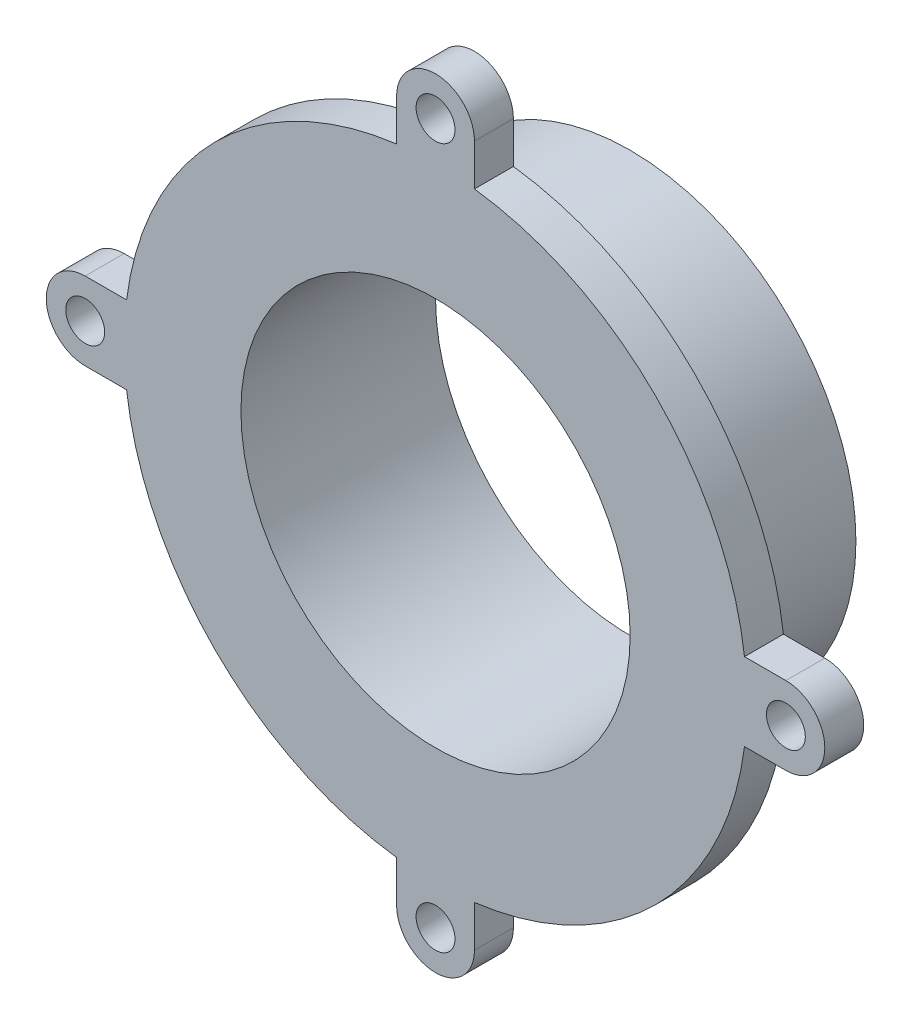
ISO-10303-21;
HEADER;
FILE_DESCRIPTION(('STEP AP214'),'2;1');
FILE_NAME('part.step','',(''),(''),'','','');
FILE_SCHEMA(('AUTOMOTIVE_DESIGN { 1 0 10303 214 1 1 1 1 }'));
ENDSEC;
DATA;
#1=APPLICATION_CONTEXT('core data for automotive mechanical design processes');
#2=APPLICATION_PROTOCOL_DEFINITION('international standard','automotive_design',2000,#1);
#3=PRODUCT_CONTEXT('',#1,'mechanical');
#4=PRODUCT('Part','Part','',(#3));
#5=PRODUCT_RELATED_PRODUCT_CATEGORY('part','',(#4));
#6=PRODUCT_DEFINITION_FORMATION('','',#4);
#7=PRODUCT_DEFINITION_CONTEXT('part definition',#1,'design');
#8=PRODUCT_DEFINITION('design','',#6,#7);
#9=PRODUCT_DEFINITION_SHAPE('','',#8);
#10=(LENGTH_UNIT() NAMED_UNIT(*) SI_UNIT(.MILLI.,.METRE.));
#11=(NAMED_UNIT(*) PLANE_ANGLE_UNIT() SI_UNIT($,.RADIAN.));
#12=(NAMED_UNIT(*) SI_UNIT($,.STERADIAN.) SOLID_ANGLE_UNIT());
#13=UNCERTAINTY_MEASURE_WITH_UNIT(LENGTH_MEASURE(1.E-05),#10,'distance_accuracy_value','');
#14=(GEOMETRIC_REPRESENTATION_CONTEXT(3) GLOBAL_UNCERTAINTY_ASSIGNED_CONTEXT((#13)) GLOBAL_UNIT_ASSIGNED_CONTEXT((#10,
#11,#12)) REPRESENTATION_CONTEXT('',''));
#15=CARTESIAN_POINT('',(0.,0.,0.));
#16=DIRECTION('',(0.,0.,1.));
#17=DIRECTION('',(1.,0.,0.));
#18=AXIS2_PLACEMENT_3D('',#15,#16,#17);
#19=CARTESIAN_POINT('',(0.,0.,5.));
#20=DIRECTION('',(0.,0.,-1.));
#21=DIRECTION('',(-1.,0.,0.));
#22=AXIS2_PLACEMENT_3D('',#19,#20,#21);
#23=CYLINDRICAL_SURFACE('',#22,40.);
#24=CARTESIAN_POINT('',(0.,0.,5.));
#25=DIRECTION('',(0.,0.,1.));
#26=DIRECTION('',(1.,0.,0.));
#27=AXIS2_PLACEMENT_3D('',#24,#25,#26);
#28=CIRCLE('',#27,40.);
#29=CARTESIAN_POINT('',(39.6862696659688,5.00000000000042,5.));
#30=VERTEX_POINT('',#29);
#31=CARTESIAN_POINT('',(5.,39.6862696659689,5.));
#32=VERTEX_POINT('',#31);
#33=EDGE_CURVE('E50',#30,#32,#28,.T.);
#34=ORIENTED_EDGE('',*,*,#33,.F.);
#35=DIRECTION('',(0.,0.,1.));
#36=VECTOR('',#35,1.);
#37=CARTESIAN_POINT('',(39.6862696659688,5.00000000000042,-14.3656894510189));
#38=LINE('',#37,#36);
#39=CARTESIAN_POINT('',(39.6862696659688,5.00000000000042,0.));
#40=VERTEX_POINT('',#39);
#41=EDGE_CURVE('E160',#40,#30,#38,.T.);
#42=ORIENTED_EDGE('',*,*,#41,.F.);
#43=CARTESIAN_POINT('',(0.,0.,0.));
#44=DIRECTION('',(0.,0.,1.));
#45=DIRECTION('',(1.,0.,0.));
#46=AXIS2_PLACEMENT_3D('',#43,#44,#45);
#47=CIRCLE('',#46,40.);
#48=CARTESIAN_POINT('',(5.,39.6862696659689,0.));
#49=VERTEX_POINT('',#48);
#50=EDGE_CURVE('E290',#40,#49,#47,.T.);
#51=ORIENTED_EDGE('',*,*,#50,.T.);
#52=DIRECTION('',(0.,0.,1.));
#53=VECTOR('',#52,1.);
#54=CARTESIAN_POINT('',(5.,39.6862696659689,-14.3656894510188));
#55=LINE('',#54,#53);
#56=EDGE_CURVE('E273',#49,#32,#55,.T.);
#57=ORIENTED_EDGE('',*,*,#56,.T.);
#58=EDGE_LOOP('',(#34,#42,#51,#57));
#59=FACE_BOUND('',#58,.T.);
#60=ADVANCED_FACE('F35',(#59),#23,.T.);
#61=CARTESIAN_POINT('',(5.,-39.6862696659689,0.));
#62=VERTEX_POINT('',#61);
#63=CARTESIAN_POINT('',(39.6862696659689,-4.99999999999958,0.));
#64=VERTEX_POINT('',#63);
#65=EDGE_CURVE('E297',#62,#64,#47,.T.);
#66=ORIENTED_EDGE('',*,*,#65,.T.);
#67=DIRECTION('',(0.,0.,1.));
#68=VECTOR('',#67,1.);
#69=CARTESIAN_POINT('',(39.6862696659689,-4.99999999999958,-14.3656894510189));
#70=LINE('',#69,#68);
#71=CARTESIAN_POINT('',(39.6862696659689,-4.99999999999958,5.));
#72=VERTEX_POINT('',#71);
#73=EDGE_CURVE('E58',#64,#72,#70,.T.);
#74=ORIENTED_EDGE('',*,*,#73,.T.);
#75=CARTESIAN_POINT('',(5.,-39.6862696659689,5.));
#76=VERTEX_POINT('',#75);
#77=EDGE_CURVE('E296',#76,#72,#28,.T.);
#78=ORIENTED_EDGE('',*,*,#77,.F.);
#79=DIRECTION('',(0.,0.,1.));
#80=VECTOR('',#79,1.);
#81=CARTESIAN_POINT('',(5.,-39.6862696659689,-14.3656894510188));
#82=LINE('',#81,#80);
#83=EDGE_CURVE('E213',#62,#76,#82,.T.);
#84=ORIENTED_EDGE('',*,*,#83,.F.);
#85=EDGE_LOOP('',(#66,#74,#78,#84));
#86=FACE_BOUND('',#85,.T.);
#87=ADVANCED_FACE('F300',(#86),#23,.T.);
#88=CARTESIAN_POINT('',(-39.6862696659688,-5.00000000000014,0.));
#89=VERTEX_POINT('',#88);
#90=CARTESIAN_POINT('',(-5.,-39.6862696659689,0.));
#91=VERTEX_POINT('',#90);
#92=EDGE_CURVE('E293',#89,#91,#47,.T.);
#93=ORIENTED_EDGE('',*,*,#92,.T.);
#94=DIRECTION('',(0.,0.,1.));
#95=VECTOR('',#94,1.);
#96=CARTESIAN_POINT('',(-5.,-39.6862696659689,-14.3656894510188));
#97=LINE('',#96,#95);
#98=CARTESIAN_POINT('',(-5.,-39.6862696659689,5.));
#99=VERTEX_POINT('',#98);
#100=EDGE_CURVE('E211',#91,#99,#97,.T.);
#101=ORIENTED_EDGE('',*,*,#100,.T.);
#102=CARTESIAN_POINT('',(-39.6862696659688,-5.00000000000014,5.));
#103=VERTEX_POINT('',#102);
#104=EDGE_CURVE('E291',#103,#99,#28,.T.);
#105=ORIENTED_EDGE('',*,*,#104,.F.);
#106=DIRECTION('',(0.,0.,1.));
#107=VECTOR('',#106,1.);
#108=CARTESIAN_POINT('',(-39.6862696659688,-5.00000000000014,-14.3656894510189));
#109=LINE('',#108,#107);
#110=EDGE_CURVE('E244',#89,#103,#109,.T.);
#111=ORIENTED_EDGE('',*,*,#110,.F.);
#112=EDGE_LOOP('',(#93,#101,#105,#111));
#113=FACE_BOUND('',#112,.T.);
#114=ADVANCED_FACE('F324',(#113),#23,.T.);
#115=CARTESIAN_POINT('',(-5.,39.6862696659689,0.));
#116=VERTEX_POINT('',#115);
#117=CARTESIAN_POINT('',(-39.6862696659689,4.99999999999986,0.));
#118=VERTEX_POINT('',#117);
#119=EDGE_CURVE('E292',#116,#118,#47,.T.);
#120=ORIENTED_EDGE('',*,*,#119,.T.);
#121=DIRECTION('',(0.,0.,1.));
#122=VECTOR('',#121,1.);
#123=CARTESIAN_POINT('',(-39.6862696659689,4.99999999999986,-14.3656894510189));
#124=LINE('',#123,#122);
#125=CARTESIAN_POINT('',(-39.6862696659689,4.99999999999986,5.));
#126=VERTEX_POINT('',#125);
#127=EDGE_CURVE('E242',#118,#126,#124,.T.);
#128=ORIENTED_EDGE('',*,*,#127,.T.);
#129=CARTESIAN_POINT('',(-5.,39.6862696659689,5.));
#130=VERTEX_POINT('',#129);
#131=EDGE_CURVE('E43',#130,#126,#28,.T.);
#132=ORIENTED_EDGE('',*,*,#131,.F.);
#133=DIRECTION('',(0.,0.,1.));
#134=VECTOR('',#133,1.);
#135=CARTESIAN_POINT('',(-5.,39.6862696659689,-14.3656894510188));
#136=LINE('',#135,#134);
#137=EDGE_CURVE('E275',#116,#130,#136,.T.);
#138=ORIENTED_EDGE('',*,*,#137,.F.);
#139=EDGE_LOOP('',(#120,#128,#132,#138));
#140=FACE_BOUND('',#139,.T.);
#141=ADVANCED_FACE('F37',(#140),#23,.T.);
#142=CARTESIAN_POINT('',(0.,0.,5.));
#143=DIRECTION('',(0.,0.,1.));
#144=DIRECTION('',(1.,0.,0.));
#145=AXIS2_PLACEMENT_3D('',#142,#143,#144);
#146=PLANE('',#145);
#147=CARTESIAN_POINT('',(0.,0.,5.));
#148=DIRECTION('',(0.,0.,1.));
#149=DIRECTION('',(1.,0.,0.));
#150=AXIS2_PLACEMENT_3D('',#147,#148,#149);
#151=CIRCLE('',#150,25.);
#152=CARTESIAN_POINT('',(25.,0.,5.));
#153=VERTEX_POINT('',#152);
#154=EDGE_CURVE('E287',#153,#153,#151,.T.);
#155=ORIENTED_EDGE('',*,*,#154,.F.);
#156=EDGE_LOOP('',(#155));
#157=FACE_BOUND('',#156,.T.);
#158=ORIENTED_EDGE('',*,*,#131,.T.);
#159=DIRECTION('',(-1.,0.,0.));
#160=VECTOR('',#159,1.);
#161=CARTESIAN_POINT('',(-39.6862696659689,4.99999999999986,5.));
#162=LINE('',#161,#160);
#163=CARTESIAN_POINT('',(-45.,4.99999999999984,5.));
#164=VERTEX_POINT('',#163);
#165=EDGE_CURVE('E237',#126,#164,#162,.T.);
#166=ORIENTED_EDGE('',*,*,#165,.T.);
#167=CARTESIAN_POINT('',(-45.,-1.57116660247941E-13,5.));
#168=DIRECTION('',(0.,0.,1.));
#169=DIRECTION('',(0.,-1.,0.));
#170=AXIS2_PLACEMENT_3D('',#167,#168,#169);
#171=CIRCLE('',#170,5.);
#172=CARTESIAN_POINT('',(-45.,-5.00000000000016,5.));
#173=VERTEX_POINT('',#172);
#174=EDGE_CURVE('E231',#164,#173,#171,.T.);
#175=ORIENTED_EDGE('',*,*,#174,.T.);
#176=DIRECTION('',(1.,0.,0.));
#177=VECTOR('',#176,1.);
#178=CARTESIAN_POINT('',(-39.6862696659688,-5.00000000000014,5.));
#179=LINE('',#178,#177);
#180=EDGE_CURVE('E234',#173,#103,#179,.T.);
#181=ORIENTED_EDGE('',*,*,#180,.T.);
#182=ORIENTED_EDGE('',*,*,#104,.T.);
#183=DIRECTION('',(0.,-1.,0.));
#184=VECTOR('',#183,1.);
#185=CARTESIAN_POINT('',(-5.,-39.6862696659689,5.));
#186=LINE('',#185,#184);
#187=CARTESIAN_POINT('',(-5.,-45.,5.));
#188=VERTEX_POINT('',#187);
#189=EDGE_CURVE('E206',#99,#188,#186,.T.);
#190=ORIENTED_EDGE('',*,*,#189,.T.);
#191=CARTESIAN_POINT('',(0.,-45.,5.));
#192=DIRECTION('',(0.,0.,1.));
#193=DIRECTION('',(1.,0.,0.));
#194=AXIS2_PLACEMENT_3D('',#191,#192,#193);
#195=CIRCLE('',#194,5.);
#196=CARTESIAN_POINT('',(5.,-45.,5.));
#197=VERTEX_POINT('',#196);
#198=EDGE_CURVE('E200',#188,#197,#195,.T.);
#199=ORIENTED_EDGE('',*,*,#198,.T.);
#200=DIRECTION('',(0.,1.,0.));
#201=VECTOR('',#200,1.);
#202=CARTESIAN_POINT('',(5.,-39.6862696659689,5.));
#203=LINE('',#202,#201);
#204=EDGE_CURVE('E203',#197,#76,#203,.T.);
#205=ORIENTED_EDGE('',*,*,#204,.T.);
#206=ORIENTED_EDGE('',*,*,#77,.T.);
#207=DIRECTION('',(1.,0.,0.));
#208=VECTOR('',#207,1.);
#209=CARTESIAN_POINT('',(39.6862696659689,-4.99999999999958,5.));
#210=LINE('',#209,#208);
#211=CARTESIAN_POINT('',(45.0000000000001,-4.99999999999953,5.));
#212=VERTEX_POINT('',#211);
#213=EDGE_CURVE('E161',#72,#212,#210,.T.);
#214=ORIENTED_EDGE('',*,*,#213,.T.);
#215=CARTESIAN_POINT('',(45.,4.71349980743823E-13,5.));
#216=DIRECTION('',(0.,0.,1.));
#217=DIRECTION('',(0.,1.,0.));
#218=AXIS2_PLACEMENT_3D('',#215,#216,#217);
#219=CIRCLE('',#218,5.);
#220=CARTESIAN_POINT('',(44.9999999999999,5.00000000000047,5.));
#221=VERTEX_POINT('',#220);
#222=EDGE_CURVE('E155',#212,#221,#219,.T.);
#223=ORIENTED_EDGE('',*,*,#222,.T.);
#224=DIRECTION('',(-1.,0.,0.));
#225=VECTOR('',#224,1.);
#226=CARTESIAN_POINT('',(39.6862696659688,5.00000000000042,5.));
#227=LINE('',#226,#225);
#228=EDGE_CURVE('E164',#221,#30,#227,.T.);
#229=ORIENTED_EDGE('',*,*,#228,.T.);
#230=ORIENTED_EDGE('',*,*,#33,.T.);
#231=DIRECTION('',(0.,1.,0.));
#232=VECTOR('',#231,1.);
#233=CARTESIAN_POINT('',(5.,39.6862696659689,5.));
#234=LINE('',#233,#232);
#235=CARTESIAN_POINT('',(5.,45.,5.));
#236=VERTEX_POINT('',#235);
#237=EDGE_CURVE('E268',#32,#236,#234,.T.);
#238=ORIENTED_EDGE('',*,*,#237,.T.);
#239=CARTESIAN_POINT('',(0.,45.,5.));
#240=DIRECTION('',(0.,0.,1.));
#241=DIRECTION('',(-1.,0.,0.));
#242=AXIS2_PLACEMENT_3D('',#239,#240,#241);
#243=CIRCLE('',#242,5.);
#244=CARTESIAN_POINT('',(-5.,45.,5.));
#245=VERTEX_POINT('',#244);
#246=EDGE_CURVE('E262',#236,#245,#243,.T.);
#247=ORIENTED_EDGE('',*,*,#246,.T.);
#248=DIRECTION('',(0.,-1.,0.));
#249=VECTOR('',#248,1.);
#250=CARTESIAN_POINT('',(-5.,39.6862696659689,5.));
#251=LINE('',#250,#249);
#252=EDGE_CURVE('E265',#245,#130,#251,.T.);
#253=ORIENTED_EDGE('',*,*,#252,.T.);
#254=EDGE_LOOP('',(#158,#166,#175,#181,#182,#190,#199,#205,#206,#214,#223,#229,#230,#238,#247,#253));
#255=FACE_BOUND('',#254,.T.);
#256=CARTESIAN_POINT('',(0.,45.,5.));
#257=DIRECTION('',(0.,0.,1.));
#258=DIRECTION('',(1.,0.,0.));
#259=AXIS2_PLACEMENT_3D('',#256,#257,#258);
#260=CIRCLE('',#259,2.5);
#261=CARTESIAN_POINT('',(2.5,45.,5.));
#262=VERTEX_POINT('',#261);
#263=EDGE_CURVE('E250',#262,#262,#260,.T.);
#264=ORIENTED_EDGE('',*,*,#263,.F.);
#265=EDGE_LOOP('',(#264));
#266=FACE_BOUND('',#265,.T.);
#267=CARTESIAN_POINT('',(-45.,-1.57116660247941E-13,5.));
#268=DIRECTION('',(0.,0.,1.));
#269=DIRECTION('',(0.,1.,0.));
#270=AXIS2_PLACEMENT_3D('',#267,#268,#269);
#271=CIRCLE('',#270,2.5);
#272=CARTESIAN_POINT('',(-45.,2.49999999999985,5.));
#273=VERTEX_POINT('',#272);
#274=EDGE_CURVE('E219',#273,#273,#271,.T.);
#275=ORIENTED_EDGE('',*,*,#274,.F.);
#276=EDGE_LOOP('',(#275));
#277=FACE_BOUND('',#276,.T.);
#278=CARTESIAN_POINT('',(0.,-45.,5.));
#279=DIRECTION('',(0.,0.,1.));
#280=DIRECTION('',(-1.,0.,0.));
#281=AXIS2_PLACEMENT_3D('',#278,#279,#280);
#282=CIRCLE('',#281,2.5);
#283=CARTESIAN_POINT('',(-2.5,-45.,5.));
#284=VERTEX_POINT('',#283);
#285=EDGE_CURVE('E187',#284,#284,#282,.T.);
#286=ORIENTED_EDGE('',*,*,#285,.F.);
#287=EDGE_LOOP('',(#286));
#288=FACE_BOUND('',#287,.T.);
#289=CARTESIAN_POINT('',(45.,4.71349980743823E-13,5.));
#290=DIRECTION('',(0.,0.,1.));
#291=DIRECTION('',(0.,-1.,0.));
#292=AXIS2_PLACEMENT_3D('',#289,#290,#291);
#293=CIRCLE('',#292,2.5);
#294=CARTESIAN_POINT('',(45.,-2.49999999999953,5.));
#295=VERTEX_POINT('',#294);
#296=EDGE_CURVE('E172',#295,#295,#293,.T.);
#297=ORIENTED_EDGE('',*,*,#296,.F.);
#298=EDGE_LOOP('',(#297));
#299=FACE_BOUND('',#298,.T.);
#300=ADVANCED_FACE('F169',(#157,#255,#266,#277,#288,#299),#146,.T.);
#301=CARTESIAN_POINT('',(0.,0.,0.));
#302=DIRECTION('',(0.,0.,1.));
#303=DIRECTION('',(1.,0.,0.));
#304=AXIS2_PLACEMENT_3D('',#301,#302,#303);
#305=PLANE('',#304);
#306=CARTESIAN_POINT('',(0.,0.,0.));
#307=DIRECTION('',(0.,0.,1.));
#308=DIRECTION('',(1.,0.,0.));
#309=AXIS2_PLACEMENT_3D('',#306,#307,#308);
#310=CIRCLE('',#309,29.);
#311=CARTESIAN_POINT('',(29.,0.,0.));
#312=VERTEX_POINT('',#311);
#313=EDGE_CURVE('E11',#312,#312,#310,.F.);
#314=ORIENTED_EDGE('',*,*,#313,.F.);
#315=EDGE_LOOP('',(#314));
#316=FACE_BOUND('',#315,.T.);
#317=ORIENTED_EDGE('',*,*,#119,.F.);
#318=DIRECTION('',(0.,1.,0.));
#319=VECTOR('',#318,1.);
#320=CARTESIAN_POINT('',(-5.,39.6862696659689,0.));
#321=LINE('',#320,#319);
#322=CARTESIAN_POINT('',(-5.,45.,0.));
#323=VERTEX_POINT('',#322);
#324=EDGE_CURVE('E251',#116,#323,#321,.T.);
#325=ORIENTED_EDGE('',*,*,#324,.T.);
#326=CARTESIAN_POINT('',(0.,45.,0.));
#327=DIRECTION('',(0.,0.,1.));
#328=DIRECTION('',(1.,0.,0.));
#329=AXIS2_PLACEMENT_3D('',#326,#327,#328);
#330=CIRCLE('',#329,5.);
#331=CARTESIAN_POINT('',(5.,45.,0.));
#332=VERTEX_POINT('',#331);
#333=EDGE_CURVE('E254',#323,#332,#330,.F.);
#334=ORIENTED_EDGE('',*,*,#333,.T.);
#335=DIRECTION('',(0.,-1.,0.));
#336=VECTOR('',#335,1.);
#337=CARTESIAN_POINT('',(5.,39.6862696659689,0.));
#338=LINE('',#337,#336);
#339=EDGE_CURVE('E255',#332,#49,#338,.T.);
#340=ORIENTED_EDGE('',*,*,#339,.T.);
#341=ORIENTED_EDGE('',*,*,#50,.F.);
#342=DIRECTION('',(1.,0.,0.));
#343=VECTOR('',#342,1.);
#344=CARTESIAN_POINT('',(39.6862696659688,5.00000000000042,0.));
#345=LINE('',#344,#343);
#346=CARTESIAN_POINT('',(44.9999999999999,5.00000000000047,0.));
#347=VERTEX_POINT('',#346);
#348=EDGE_CURVE('E188',#40,#347,#345,.T.);
#349=ORIENTED_EDGE('',*,*,#348,.T.);
#350=CARTESIAN_POINT('',(45.,4.71349980743823E-13,0.));
#351=DIRECTION('',(0.,0.,1.));
#352=DIRECTION('',(1.,0.,0.));
#353=AXIS2_PLACEMENT_3D('',#350,#351,#352);
#354=CIRCLE('',#353,5.);
#355=CARTESIAN_POINT('',(45.0000000000001,-4.99999999999953,0.));
#356=VERTEX_POINT('',#355);
#357=EDGE_CURVE('E157',#347,#356,#354,.F.);
#358=ORIENTED_EDGE('',*,*,#357,.T.);
#359=DIRECTION('',(-1.,0.,0.));
#360=VECTOR('',#359,1.);
#361=CARTESIAN_POINT('',(39.6862696659689,-4.99999999999958,0.));
#362=LINE('',#361,#360);
#363=EDGE_CURVE('E181',#356,#64,#362,.T.);
#364=ORIENTED_EDGE('',*,*,#363,.T.);
#365=ORIENTED_EDGE('',*,*,#65,.F.);
#366=DIRECTION('',(0.,-1.,0.));
#367=VECTOR('',#366,1.);
#368=CARTESIAN_POINT('',(5.,-39.6862696659689,0.));
#369=LINE('',#368,#367);
#370=CARTESIAN_POINT('',(5.,-45.,0.));
#371=VERTEX_POINT('',#370);
#372=EDGE_CURVE('E189',#62,#371,#369,.T.);
#373=ORIENTED_EDGE('',*,*,#372,.T.);
#374=CARTESIAN_POINT('',(0.,-45.,0.));
#375=DIRECTION('',(0.,0.,1.));
#376=DIRECTION('',(1.,0.,0.));
#377=AXIS2_PLACEMENT_3D('',#374,#375,#376);
#378=CIRCLE('',#377,5.);
#379=CARTESIAN_POINT('',(-5.,-45.,0.));
#380=VERTEX_POINT('',#379);
#381=EDGE_CURVE('E192',#371,#380,#378,.F.);
#382=ORIENTED_EDGE('',*,*,#381,.T.);
#383=DIRECTION('',(0.,1.,0.));
#384=VECTOR('',#383,1.);
#385=CARTESIAN_POINT('',(-5.,-39.6862696659689,0.));
#386=LINE('',#385,#384);
#387=EDGE_CURVE('E193',#380,#91,#386,.T.);
#388=ORIENTED_EDGE('',*,*,#387,.T.);
#389=ORIENTED_EDGE('',*,*,#92,.F.);
#390=DIRECTION('',(-1.,0.,0.));
#391=VECTOR('',#390,1.);
#392=CARTESIAN_POINT('',(-39.6862696659688,-5.00000000000014,0.));
#393=LINE('',#392,#391);
#394=CARTESIAN_POINT('',(-45.,-5.00000000000016,0.));
#395=VERTEX_POINT('',#394);
#396=EDGE_CURVE('E220',#89,#395,#393,.T.);
#397=ORIENTED_EDGE('',*,*,#396,.T.);
#398=CARTESIAN_POINT('',(-45.,-1.57116660247941E-13,0.));
#399=DIRECTION('',(0.,0.,1.));
#400=DIRECTION('',(1.,0.,0.));
#401=AXIS2_PLACEMENT_3D('',#398,#399,#400);
#402=CIRCLE('',#401,5.);
#403=CARTESIAN_POINT('',(-45.,4.99999999999984,0.));
#404=VERTEX_POINT('',#403);
#405=EDGE_CURVE('E223',#395,#404,#402,.F.);
#406=ORIENTED_EDGE('',*,*,#405,.T.);
#407=DIRECTION('',(1.,0.,0.));
#408=VECTOR('',#407,1.);
#409=CARTESIAN_POINT('',(-39.6862696659689,4.99999999999986,0.));
#410=LINE('',#409,#408);
#411=EDGE_CURVE('E224',#404,#118,#410,.T.);
#412=ORIENTED_EDGE('',*,*,#411,.T.);
#413=EDGE_LOOP('',(#317,#325,#334,#340,#341,#349,#358,#364,#365,#373,#382,#388,#389,#397,#406,#412));
#414=FACE_BOUND('',#413,.T.);
#415=CARTESIAN_POINT('',(0.,45.,0.));
#416=DIRECTION('',(0.,0.,1.));
#417=DIRECTION('',(1.,0.,0.));
#418=AXIS2_PLACEMENT_3D('',#415,#416,#417);
#419=CIRCLE('',#418,2.5);
#420=CARTESIAN_POINT('',(2.5,45.,0.));
#421=VERTEX_POINT('',#420);
#422=EDGE_CURVE('E253',#421,#421,#419,.F.);
#423=ORIENTED_EDGE('',*,*,#422,.F.);
#424=EDGE_LOOP('',(#423));
#425=FACE_BOUND('',#424,.T.);
#426=CARTESIAN_POINT('',(-45.,-1.57116660247941E-13,0.));
#427=DIRECTION('',(0.,0.,1.));
#428=DIRECTION('',(1.,0.,0.));
#429=AXIS2_PLACEMENT_3D('',#426,#427,#428);
#430=CIRCLE('',#429,2.5);
#431=CARTESIAN_POINT('',(-42.5,-1.57116660247941E-13,0.));
#432=VERTEX_POINT('',#431);
#433=EDGE_CURVE('E222',#432,#432,#430,.F.);
#434=ORIENTED_EDGE('',*,*,#433,.F.);
#435=EDGE_LOOP('',(#434));
#436=FACE_BOUND('',#435,.T.);
#437=CARTESIAN_POINT('',(0.,-45.,0.));
#438=DIRECTION('',(0.,0.,1.));
#439=DIRECTION('',(1.,0.,0.));
#440=AXIS2_PLACEMENT_3D('',#437,#438,#439);
#441=CIRCLE('',#440,2.5);
#442=CARTESIAN_POINT('',(2.5,-45.,0.));
#443=VERTEX_POINT('',#442);
#444=EDGE_CURVE('E191',#443,#443,#441,.F.);
#445=ORIENTED_EDGE('',*,*,#444,.F.);
#446=EDGE_LOOP('',(#445));
#447=FACE_BOUND('',#446,.T.);
#448=CARTESIAN_POINT('',(45.,4.71349980743823E-13,0.));
#449=DIRECTION('',(0.,0.,1.));
#450=DIRECTION('',(1.,0.,0.));
#451=AXIS2_PLACEMENT_3D('',#448,#449,#450);
#452=CIRCLE('',#451,2.5);
#453=CARTESIAN_POINT('',(47.5,4.71349980743823E-13,0.));
#454=VERTEX_POINT('',#453);
#455=EDGE_CURVE('E184',#454,#454,#452,.F.);
#456=ORIENTED_EDGE('',*,*,#455,.F.);
#457=EDGE_LOOP('',(#456));
#458=FACE_BOUND('',#457,.T.);
#459=ADVANCED_FACE('F304',(#316,#414,#425,#436,#447,#458),#305,.F.);
#460=CARTESIAN_POINT('',(0.,0.,8.));
#461=DIRECTION('',(0.,0.,-1.));
#462=DIRECTION('',(-1.,0.,0.));
#463=AXIS2_PLACEMENT_3D('',#460,#461,#462);
#464=CYLINDRICAL_SURFACE('',#463,25.);
#465=ORIENTED_EDGE('',*,*,#154,.T.);
#466=EDGE_LOOP('',(#465));
#467=FACE_BOUND('',#466,.T.);
#468=CARTESIAN_POINT('',(0.,0.,-20.));
#469=DIRECTION('',(0.,0.,-1.));
#470=DIRECTION('',(-1.,0.,0.));
#471=AXIS2_PLACEMENT_3D('',#468,#469,#470);
#472=CIRCLE('',#471,25.);
#473=CARTESIAN_POINT('',(-25.,0.,-20.));
#474=VERTEX_POINT('',#473);
#475=EDGE_CURVE('E281',#474,#474,#472,.F.);
#476=ORIENTED_EDGE('',*,*,#475,.F.);
#477=EDGE_LOOP('',(#476));
#478=FACE_BOUND('',#477,.T.);
#479=ADVANCED_FACE('F403',(#467,#478),#464,.F.);
#480=CARTESIAN_POINT('',(0.,0.,-20.));
#481=DIRECTION('',(0.,0.,1.));
#482=DIRECTION('',(1.,0.,0.));
#483=AXIS2_PLACEMENT_3D('',#480,#481,#482);
#484=CYLINDRICAL_SURFACE('',#483,29.);
#485=CARTESIAN_POINT('',(0.,0.,-20.));
#486=DIRECTION('',(0.,0.,-1.));
#487=DIRECTION('',(-1.,0.,0.));
#488=AXIS2_PLACEMENT_3D('',#485,#486,#487);
#489=CIRCLE('',#488,29.);
#490=CARTESIAN_POINT('',(-29.,0.,-20.));
#491=VERTEX_POINT('',#490);
#492=EDGE_CURVE('E284',#491,#491,#489,.T.);
#493=ORIENTED_EDGE('',*,*,#492,.F.);
#494=EDGE_LOOP('',(#493));
#495=FACE_BOUND('',#494,.T.);
#496=ORIENTED_EDGE('',*,*,#313,.T.);
#497=EDGE_LOOP('',(#496));
#498=FACE_BOUND('',#497,.T.);
#499=ADVANCED_FACE('F399',(#495,#498),#484,.T.);
#500=CARTESIAN_POINT('',(0.,0.,-20.));
#501=DIRECTION('',(0.,0.,-1.));
#502=DIRECTION('',(-1.,0.,0.));
#503=AXIS2_PLACEMENT_3D('',#500,#501,#502);
#504=PLANE('',#503);
#505=ORIENTED_EDGE('',*,*,#475,.T.);
#506=EDGE_LOOP('',(#505));
#507=FACE_BOUND('',#506,.T.);
#508=ORIENTED_EDGE('',*,*,#492,.T.);
#509=EDGE_LOOP('',(#508));
#510=FACE_BOUND('',#509,.T.);
#511=ADVANCED_FACE('F392',(#507,#510),#504,.T.);
#512=CARTESIAN_POINT('',(-5.,39.6862696659689,-14.3656894510188));
#513=DIRECTION('',(-1.,0.,0.));
#514=DIRECTION('',(0.,0.,1.));
#515=AXIS2_PLACEMENT_3D('',#512,#513,#514);
#516=PLANE('',#515);
#517=ORIENTED_EDGE('',*,*,#324,.F.);
#518=ORIENTED_EDGE('',*,*,#137,.T.);
#519=ORIENTED_EDGE('',*,*,#252,.F.);
#520=DIRECTION('',(0.,0.,1.));
#521=VECTOR('',#520,1.);
#522=CARTESIAN_POINT('',(-5.,45.,-14.3656894510188));
#523=LINE('',#522,#521);
#524=EDGE_CURVE('E271',#323,#245,#523,.T.);
#525=ORIENTED_EDGE('',*,*,#524,.F.);
#526=EDGE_LOOP('',(#517,#518,#519,#525));
#527=FACE_BOUND('',#526,.T.);
#528=ADVANCED_FACE('F388',(#527),#516,.T.);
#529=CARTESIAN_POINT('',(5.,39.6862696659689,-14.3656894510188));
#530=DIRECTION('',(1.,0.,0.));
#531=DIRECTION('',(0.,0.,-1.));
#532=AXIS2_PLACEMENT_3D('',#529,#530,#531);
#533=PLANE('',#532);
#534=ORIENTED_EDGE('',*,*,#339,.F.);
#535=DIRECTION('',(0.,0.,1.));
#536=VECTOR('',#535,1.);
#537=CARTESIAN_POINT('',(5.,45.,-14.3656894510188));
#538=LINE('',#537,#536);
#539=EDGE_CURVE('E258',#332,#236,#538,.T.);
#540=ORIENTED_EDGE('',*,*,#539,.T.);
#541=ORIENTED_EDGE('',*,*,#237,.F.);
#542=ORIENTED_EDGE('',*,*,#56,.F.);
#543=EDGE_LOOP('',(#534,#540,#541,#542));
#544=FACE_BOUND('',#543,.T.);
#545=ADVANCED_FACE('F385',(#544),#533,.T.);
#546=CARTESIAN_POINT('',(0.,45.,-14.3656894510188));
#547=DIRECTION('',(0.,0.,1.));
#548=DIRECTION('',(1.,0.,0.));
#549=AXIS2_PLACEMENT_3D('',#546,#547,#548);
#550=CYLINDRICAL_SURFACE('',#549,5.);
#551=ORIENTED_EDGE('',*,*,#333,.F.);
#552=ORIENTED_EDGE('',*,*,#524,.T.);
#553=ORIENTED_EDGE('',*,*,#246,.F.);
#554=ORIENTED_EDGE('',*,*,#539,.F.);
#555=EDGE_LOOP('',(#551,#552,#553,#554));
#556=FACE_BOUND('',#555,.T.);
#557=ADVANCED_FACE('F383',(#556),#550,.T.);
#558=CARTESIAN_POINT('',(0.,45.,-14.3656894510188));
#559=DIRECTION('',(0.,0.,1.));
#560=DIRECTION('',(1.,0.,0.));
#561=AXIS2_PLACEMENT_3D('',#558,#559,#560);
#562=CYLINDRICAL_SURFACE('',#561,2.5);
#563=ORIENTED_EDGE('',*,*,#422,.T.);
#564=EDGE_LOOP('',(#563));
#565=FACE_BOUND('',#564,.T.);
#566=ORIENTED_EDGE('',*,*,#263,.T.);
#567=EDGE_LOOP('',(#566));
#568=FACE_BOUND('',#567,.T.);
#569=ADVANCED_FACE('F376',(#565,#568),#562,.F.);
#570=CARTESIAN_POINT('',(-39.6862696659688,-5.00000000000014,-14.3656894510189));
#571=DIRECTION('',(0.,-1.,0.));
#572=DIRECTION('',(1.,0.,0.));
#573=AXIS2_PLACEMENT_3D('',#570,#571,#572);
#574=PLANE('',#573);
#575=ORIENTED_EDGE('',*,*,#396,.F.);
#576=ORIENTED_EDGE('',*,*,#110,.T.);
#577=ORIENTED_EDGE('',*,*,#180,.F.);
#578=DIRECTION('',(0.,0.,1.));
#579=VECTOR('',#578,1.);
#580=CARTESIAN_POINT('',(-45.,-5.00000000000016,-14.3656894510189));
#581=LINE('',#580,#579);
#582=EDGE_CURVE('E240',#395,#173,#581,.T.);
#583=ORIENTED_EDGE('',*,*,#582,.F.);
#584=EDGE_LOOP('',(#575,#576,#577,#583));
#585=FACE_BOUND('',#584,.T.);
#586=ADVANCED_FACE('F372',(#585),#574,.T.);
#587=CARTESIAN_POINT('',(-39.6862696659689,4.99999999999986,-14.3656894510189));
#588=DIRECTION('',(0.,1.,0.));
#589=DIRECTION('',(-1.,0.,0.));
#590=AXIS2_PLACEMENT_3D('',#587,#588,#589);
#591=PLANE('',#590);
#592=ORIENTED_EDGE('',*,*,#411,.F.);
#593=DIRECTION('',(0.,0.,1.));
#594=VECTOR('',#593,1.);
#595=CARTESIAN_POINT('',(-45.,4.99999999999984,-14.3656894510189));
#596=LINE('',#595,#594);
#597=EDGE_CURVE('E227',#404,#164,#596,.T.);
#598=ORIENTED_EDGE('',*,*,#597,.T.);
#599=ORIENTED_EDGE('',*,*,#165,.F.);
#600=ORIENTED_EDGE('',*,*,#127,.F.);
#601=EDGE_LOOP('',(#592,#598,#599,#600));
#602=FACE_BOUND('',#601,.T.);
#603=ADVANCED_FACE('F369',(#602),#591,.T.);
#604=CARTESIAN_POINT('',(-45.,-1.57116660247941E-13,-14.3656894510189));
#605=DIRECTION('',(0.,0.,1.));
#606=DIRECTION('',(1.,0.,0.));
#607=AXIS2_PLACEMENT_3D('',#604,#605,#606);
#608=CYLINDRICAL_SURFACE('',#607,5.);
#609=ORIENTED_EDGE('',*,*,#405,.F.);
#610=ORIENTED_EDGE('',*,*,#582,.T.);
#611=ORIENTED_EDGE('',*,*,#174,.F.);
#612=ORIENTED_EDGE('',*,*,#597,.F.);
#613=EDGE_LOOP('',(#609,#610,#611,#612));
#614=FACE_BOUND('',#613,.T.);
#615=ADVANCED_FACE('F367',(#614),#608,.T.);
#616=CARTESIAN_POINT('',(-45.,-1.57116660247941E-13,-14.3656894510189));
#617=DIRECTION('',(0.,0.,1.));
#618=DIRECTION('',(1.,0.,0.));
#619=AXIS2_PLACEMENT_3D('',#616,#617,#618);
#620=CYLINDRICAL_SURFACE('',#619,2.5);
#621=ORIENTED_EDGE('',*,*,#433,.T.);
#622=EDGE_LOOP('',(#621));
#623=FACE_BOUND('',#622,.T.);
#624=ORIENTED_EDGE('',*,*,#274,.T.);
#625=EDGE_LOOP('',(#624));
#626=FACE_BOUND('',#625,.T.);
#627=ADVANCED_FACE('F364',(#623,#626),#620,.F.);
#628=CARTESIAN_POINT('',(5.,-39.6862696659689,-14.3656894510188));
#629=DIRECTION('',(1.,0.,0.));
#630=DIRECTION('',(0.,0.,-1.));
#631=AXIS2_PLACEMENT_3D('',#628,#629,#630);
#632=PLANE('',#631);
#633=ORIENTED_EDGE('',*,*,#372,.F.);
#634=ORIENTED_EDGE('',*,*,#83,.T.);
#635=ORIENTED_EDGE('',*,*,#204,.F.);
#636=DIRECTION('',(0.,0.,1.));
#637=VECTOR('',#636,1.);
#638=CARTESIAN_POINT('',(5.,-45.,-14.3656894510188));
#639=LINE('',#638,#637);
#640=EDGE_CURVE('E209',#371,#197,#639,.T.);
#641=ORIENTED_EDGE('',*,*,#640,.F.);
#642=EDGE_LOOP('',(#633,#634,#635,#641));
#643=FACE_BOUND('',#642,.T.);
#644=ADVANCED_FACE('F349',(#643),#632,.T.);
#645=CARTESIAN_POINT('',(-5.,-39.6862696659689,-14.3656894510188));
#646=DIRECTION('',(-1.,0.,0.));
#647=DIRECTION('',(0.,0.,1.));
#648=AXIS2_PLACEMENT_3D('',#645,#646,#647);
#649=PLANE('',#648);
#650=ORIENTED_EDGE('',*,*,#387,.F.);
#651=DIRECTION('',(0.,0.,1.));
#652=VECTOR('',#651,1.);
#653=CARTESIAN_POINT('',(-5.,-45.,-14.3656894510188));
#654=LINE('',#653,#652);
#655=EDGE_CURVE('E196',#380,#188,#654,.T.);
#656=ORIENTED_EDGE('',*,*,#655,.T.);
#657=ORIENTED_EDGE('',*,*,#189,.F.);
#658=ORIENTED_EDGE('',*,*,#100,.F.);
#659=EDGE_LOOP('',(#650,#656,#657,#658));
#660=FACE_BOUND('',#659,.T.);
#661=ADVANCED_FACE('F344',(#660),#649,.T.);
#662=CARTESIAN_POINT('',(0.,-45.,-14.3656894510188));
#663=DIRECTION('',(0.,0.,1.));
#664=DIRECTION('',(1.,0.,0.));
#665=AXIS2_PLACEMENT_3D('',#662,#663,#664);
#666=CYLINDRICAL_SURFACE('',#665,5.);
#667=ORIENTED_EDGE('',*,*,#381,.F.);
#668=ORIENTED_EDGE('',*,*,#640,.T.);
#669=ORIENTED_EDGE('',*,*,#198,.F.);
#670=ORIENTED_EDGE('',*,*,#655,.F.);
#671=EDGE_LOOP('',(#667,#668,#669,#670));
#672=FACE_BOUND('',#671,.T.);
#673=ADVANCED_FACE('F352',(#672),#666,.T.);
#674=CARTESIAN_POINT('',(0.,-45.,-14.3656894510188));
#675=DIRECTION('',(0.,0.,1.));
#676=DIRECTION('',(1.,0.,0.));
#677=AXIS2_PLACEMENT_3D('',#674,#675,#676);
#678=CYLINDRICAL_SURFACE('',#677,2.5);
#679=ORIENTED_EDGE('',*,*,#444,.T.);
#680=EDGE_LOOP('',(#679));
#681=FACE_BOUND('',#680,.T.);
#682=ORIENTED_EDGE('',*,*,#285,.T.);
#683=EDGE_LOOP('',(#682));
#684=FACE_BOUND('',#683,.T.);
#685=ADVANCED_FACE('F317',(#681,#684),#678,.F.);
#686=CARTESIAN_POINT('',(39.6862696659688,5.00000000000042,-14.3656894510189));
#687=DIRECTION('',(0.,1.,0.));
#688=DIRECTION('',(-1.,0.,0.));
#689=AXIS2_PLACEMENT_3D('',#686,#687,#688);
#690=PLANE('',#689);
#691=ORIENTED_EDGE('',*,*,#348,.F.);
#692=ORIENTED_EDGE('',*,*,#41,.T.);
#693=ORIENTED_EDGE('',*,*,#228,.F.);
#694=DIRECTION('',(0.,0.,1.));
#695=VECTOR('',#694,1.);
#696=CARTESIAN_POINT('',(44.9999999999999,5.00000000000047,-14.3656894510189));
#697=LINE('',#696,#695);
#698=EDGE_CURVE('E150',#347,#221,#697,.T.);
#699=ORIENTED_EDGE('',*,*,#698,.F.);
#700=EDGE_LOOP('',(#691,#692,#693,#699));
#701=FACE_BOUND('',#700,.T.);
#702=ADVANCED_FACE('F165',(#701),#690,.T.);
#703=CARTESIAN_POINT('',(39.6862696659689,-4.99999999999958,-14.3656894510189));
#704=DIRECTION('',(0.,-1.,0.));
#705=DIRECTION('',(1.,0.,0.));
#706=AXIS2_PLACEMENT_3D('',#703,#704,#705);
#707=PLANE('',#706);
#708=ORIENTED_EDGE('',*,*,#363,.F.);
#709=DIRECTION('',(0.,0.,1.));
#710=VECTOR('',#709,1.);
#711=CARTESIAN_POINT('',(45.0000000000001,-4.99999999999953,-14.3656894510189));
#712=LINE('',#711,#710);
#713=EDGE_CURVE('E179',#356,#212,#712,.T.);
#714=ORIENTED_EDGE('',*,*,#713,.T.);
#715=ORIENTED_EDGE('',*,*,#213,.F.);
#716=ORIENTED_EDGE('',*,*,#73,.F.);
#717=EDGE_LOOP('',(#708,#714,#715,#716));
#718=FACE_BOUND('',#717,.T.);
#719=ADVANCED_FACE('F308',(#718),#707,.T.);
#720=CARTESIAN_POINT('',(45.,4.71349980743823E-13,-14.3656894510189));
#721=DIRECTION('',(0.,0.,1.));
#722=DIRECTION('',(1.,0.,0.));
#723=AXIS2_PLACEMENT_3D('',#720,#721,#722);
#724=CYLINDRICAL_SURFACE('',#723,5.);
#725=ORIENTED_EDGE('',*,*,#357,.F.);
#726=ORIENTED_EDGE('',*,*,#698,.T.);
#727=ORIENTED_EDGE('',*,*,#222,.F.);
#728=ORIENTED_EDGE('',*,*,#713,.F.);
#729=EDGE_LOOP('',(#725,#726,#727,#728));
#730=FACE_BOUND('',#729,.T.);
#731=ADVANCED_FACE('F152',(#730),#724,.T.);
#732=CARTESIAN_POINT('',(45.,4.71349980743823E-13,-14.3656894510189));
#733=DIRECTION('',(0.,0.,1.));
#734=DIRECTION('',(1.,0.,0.));
#735=AXIS2_PLACEMENT_3D('',#732,#733,#734);
#736=CYLINDRICAL_SURFACE('',#735,2.5);
#737=ORIENTED_EDGE('',*,*,#455,.T.);
#738=EDGE_LOOP('',(#737));
#739=FACE_BOUND('',#738,.T.);
#740=ORIENTED_EDGE('',*,*,#296,.T.);
#741=EDGE_LOOP('',(#740));
#742=FACE_BOUND('',#741,.T.);
#743=ADVANCED_FACE('F315',(#739,#742),#736,.F.);
#744=CLOSED_SHELL('',(#60,#87,#114,#141,#300,#459,#479,#499,#511,#528,#545,#557,#569,#586,#603,
#615,#627,#644,#661,#673,#685,#702,#719,#731,#743));
#745=MANIFOLD_SOLID_BREP('B2',#744);
#746=ADVANCED_BREP_SHAPE_REPRESENTATION('',(#18,#745),#14);
#747=SHAPE_DEFINITION_REPRESENTATION(#9,#746);
ENDSEC;
END-ISO-10303-21;
